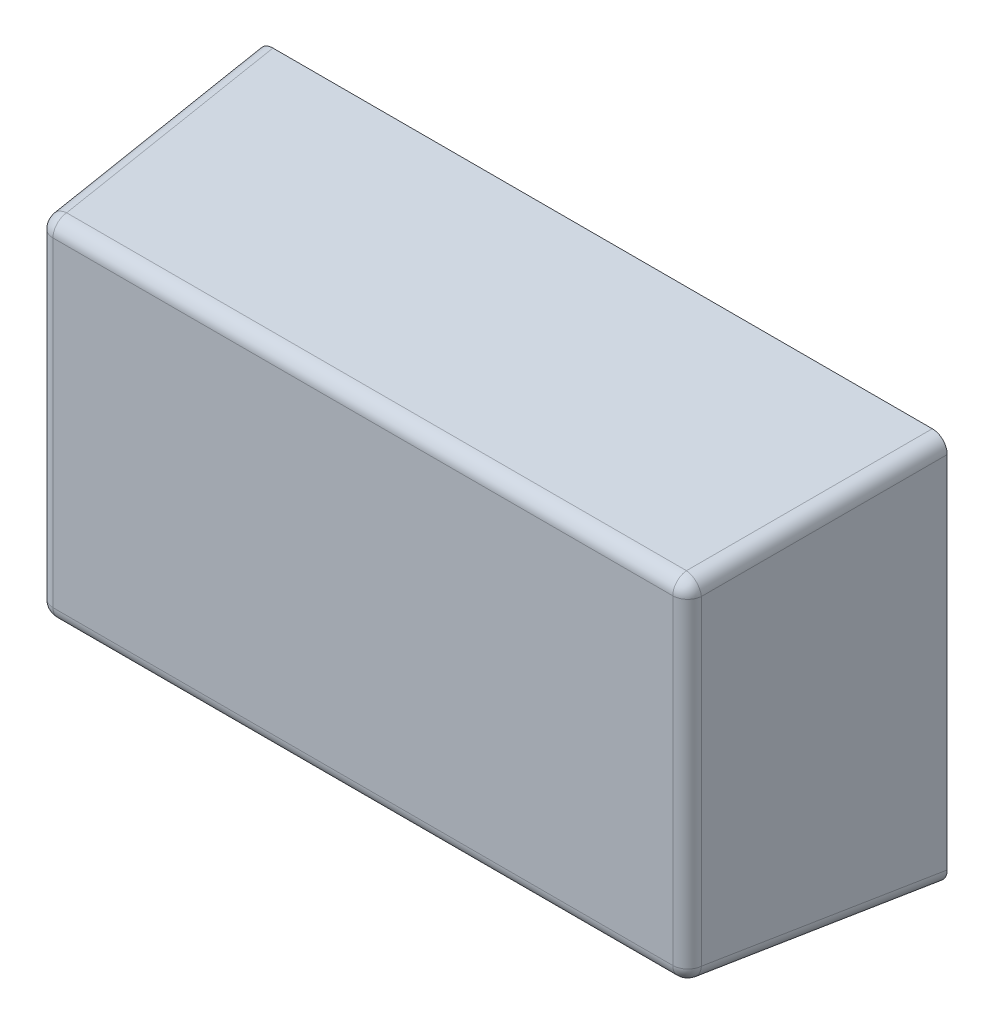
ISO-10303-21;
HEADER;
FILE_DESCRIPTION(('STEP AP214'),'2;1');
FILE_NAME('part.step','',(''),(''),'','','');
FILE_SCHEMA(('AUTOMOTIVE_DESIGN { 1 0 10303 214 1 1 1 1 }'));
ENDSEC;
DATA;
#1=APPLICATION_CONTEXT('core data for automotive mechanical design processes');
#2=APPLICATION_PROTOCOL_DEFINITION('international standard','automotive_design',2000,#1);
#3=PRODUCT_CONTEXT('',#1,'mechanical');
#4=PRODUCT('Part','Part','',(#3));
#5=PRODUCT_RELATED_PRODUCT_CATEGORY('part','',(#4));
#6=PRODUCT_DEFINITION_FORMATION('','',#4);
#7=PRODUCT_DEFINITION_CONTEXT('part definition',#1,'design');
#8=PRODUCT_DEFINITION('design','',#6,#7);
#9=PRODUCT_DEFINITION_SHAPE('','',#8);
#10=(LENGTH_UNIT() NAMED_UNIT(*) SI_UNIT(.MILLI.,.METRE.));
#11=(NAMED_UNIT(*) PLANE_ANGLE_UNIT() SI_UNIT($,.RADIAN.));
#12=(NAMED_UNIT(*) SI_UNIT($,.STERADIAN.) SOLID_ANGLE_UNIT());
#13=UNCERTAINTY_MEASURE_WITH_UNIT(LENGTH_MEASURE(1.E-05),#10,'distance_accuracy_value','');
#14=(GEOMETRIC_REPRESENTATION_CONTEXT(3) GLOBAL_UNCERTAINTY_ASSIGNED_CONTEXT((#13)) GLOBAL_UNIT_ASSIGNED_CONTEXT((#10,
#11,#12)) REPRESENTATION_CONTEXT('',''));
#15=CARTESIAN_POINT('',(0.,0.,0.));
#16=DIRECTION('',(0.,0.,1.));
#17=DIRECTION('',(1.,0.,0.));
#18=AXIS2_PLACEMENT_3D('',#15,#16,#17);
#19=CARTESIAN_POINT('',(-2.76838502095678,0.631614979043221,1.5));
#20=DIRECTION('',(0.222190287037998,0.974625599379366,0.0271370112647706));
#21=DIRECTION('',(-0.970240406133399,0.218271499831321,0.104838478944911));
#22=AXIS2_PLACEMENT_3D('',#19,#20,#21);
#23=SPHERICAL_SURFACE('',#22,0.1);
#24=CARTESIAN_POINT('',(-2.76838502095678,0.631614979043221,1.5));
#25=DIRECTION('',(0.0868265938642475,0.0868265938642476,0.992432509138967));
#26=DIRECTION('',(0.,-0.996194698091746,0.0871557427476582));
#27=AXIS2_PLACEMENT_3D('',#24,#25,#26);
#28=CIRCLE('',#27,0.1);
#29=CARTESIAN_POINT('',(-2.76838502095678,0.531995509234046,1.50871557427477));
#30=VERTEX_POINT('',#29);
#31=CARTESIAN_POINT('',(-2.86800449076595,0.631614979043221,1.50871557427477));
#32=VERTEX_POINT('',#31);
#33=EDGE_CURVE('E126',#30,#32,#28,.F.);
#34=ORIENTED_EDGE('',*,*,#33,.F.);
#35=CARTESIAN_POINT('',(-2.76838502095678,0.631614979043221,1.5));
#36=DIRECTION('',(-1.,0.,0.));
#37=DIRECTION('',(0.,-1.,0.));
#38=AXIS2_PLACEMENT_3D('',#35,#36,#37);
#39=CIRCLE('',#38,0.1);
#40=CARTESIAN_POINT('',(-2.76838502095678,0.631614979043221,1.6));
#41=VERTEX_POINT('',#40);
#42=EDGE_CURVE('E128',#41,#30,#39,.F.);
#43=ORIENTED_EDGE('',*,*,#42,.F.);
#44=CARTESIAN_POINT('',(-2.76838502095678,0.631614979043221,1.5));
#45=DIRECTION('',(0.,1.,0.));
#46=DIRECTION('',(-1.,0.,0.));
#47=AXIS2_PLACEMENT_3D('',#44,#45,#46);
#48=CIRCLE('',#47,0.1);
#49=EDGE_CURVE('E94',#32,#41,#48,.T.);
#50=ORIENTED_EDGE('',*,*,#49,.F.);
#51=EDGE_LOOP('',(#34,#43,#50));
#52=FACE_BOUND('',#51,.T.);
#53=ADVANCED_FACE('F16',(#52),#23,.T.);
#54=CARTESIAN_POINT('',(1.36838502095678,0.631614979043221,1.5));
#55=DIRECTION('',(0.222190287037998,0.974625599379366,0.0271370112647706));
#56=DIRECTION('',(-0.970240406133399,0.218271499831321,0.104838478944911));
#57=AXIS2_PLACEMENT_3D('',#54,#55,#56);
#58=SPHERICAL_SURFACE('',#57,0.1);
#59=CARTESIAN_POINT('',(1.36838502095678,0.631614979043221,1.5));
#60=DIRECTION('',(-0.0868265938642475,0.0868265938642476,0.992432509138967));
#61=DIRECTION('',(0.,-0.996194698091746,0.0871557427476582));
#62=AXIS2_PLACEMENT_3D('',#59,#60,#61);
#63=CIRCLE('',#62,0.1);
#64=CARTESIAN_POINT('',(1.46800449076595,0.631614979043219,1.50871557427477));
#65=VERTEX_POINT('',#64);
#66=CARTESIAN_POINT('',(1.36838502095678,0.531995509234047,1.50871557427477));
#67=VERTEX_POINT('',#66);
#68=EDGE_CURVE('E139',#65,#67,#63,.F.);
#69=ORIENTED_EDGE('',*,*,#68,.F.);
#70=CARTESIAN_POINT('',(1.36838502095678,0.631614979043221,1.5));
#71=DIRECTION('',(0.,-1.,0.));
#72=DIRECTION('',(0.,0.,-1.));
#73=AXIS2_PLACEMENT_3D('',#70,#71,#72);
#74=CIRCLE('',#73,0.1);
#75=CARTESIAN_POINT('',(1.36838502095678,0.631614979043221,1.6));
#76=VERTEX_POINT('',#75);
#77=EDGE_CURVE('E133',#76,#65,#74,.F.);
#78=ORIENTED_EDGE('',*,*,#77,.F.);
#79=CARTESIAN_POINT('',(1.36838502095678,0.631614979043221,1.5));
#80=DIRECTION('',(-1.,0.,0.));
#81=DIRECTION('',(0.,-1.,0.));
#82=AXIS2_PLACEMENT_3D('',#79,#80,#81);
#83=CIRCLE('',#82,0.1);
#84=EDGE_CURVE('E130',#67,#76,#83,.T.);
#85=ORIENTED_EDGE('',*,*,#84,.F.);
#86=EDGE_LOOP('',(#69,#78,#85));
#87=FACE_BOUND('',#86,.T.);
#88=ADVANCED_FACE('F154',(#87),#58,.T.);
#89=CARTESIAN_POINT('',(-2.76838502095678,2.76838502095678,1.5));
#90=DIRECTION('',(0.222190287037998,0.974625599379366,0.0271370112647706));
#91=DIRECTION('',(-0.970240406133399,0.218271499831321,0.104838478944911));
#92=AXIS2_PLACEMENT_3D('',#89,#90,#91);
#93=SPHERICAL_SURFACE('',#92,0.1);
#94=CARTESIAN_POINT('',(-2.76838502095678,2.76838502095678,1.5));
#95=DIRECTION('',(0.0868265938642475,-0.0868265938642475,0.992432509138967));
#96=DIRECTION('',(0.,-0.996194698091746,-0.0871557427476581));
#97=AXIS2_PLACEMENT_3D('',#94,#95,#96);
#98=CIRCLE('',#97,0.1);
#99=CARTESIAN_POINT('',(-2.86800449076595,2.76838502095678,1.50871557427477));
#100=VERTEX_POINT('',#99);
#101=CARTESIAN_POINT('',(-2.76838502095678,2.86800449076595,1.50871557427477));
#102=VERTEX_POINT('',#101);
#103=EDGE_CURVE('E122',#100,#102,#98,.F.);
#104=ORIENTED_EDGE('',*,*,#103,.F.);
#105=CARTESIAN_POINT('',(-2.76838502095678,2.76838502095678,1.5));
#106=DIRECTION('',(0.,1.,0.));
#107=DIRECTION('',(-1.,0.,0.));
#108=AXIS2_PLACEMENT_3D('',#105,#106,#107);
#109=CIRCLE('',#108,0.1);
#110=CARTESIAN_POINT('',(-2.76838502095678,2.76838502095678,1.6));
#111=VERTEX_POINT('',#110);
#112=EDGE_CURVE('E20',#111,#100,#109,.F.);
#113=ORIENTED_EDGE('',*,*,#112,.F.);
#114=CARTESIAN_POINT('',(-2.76838502095678,2.76838502095678,1.5));
#115=DIRECTION('',(1.,0.,0.));
#116=DIRECTION('',(0.,0.,-1.));
#117=AXIS2_PLACEMENT_3D('',#114,#115,#116);
#118=CIRCLE('',#117,0.1);
#119=EDGE_CURVE('E110',#102,#111,#118,.T.);
#120=ORIENTED_EDGE('',*,*,#119,.F.);
#121=EDGE_LOOP('',(#104,#113,#120));
#122=FACE_BOUND('',#121,.T.);
#123=ADVANCED_FACE('F120',(#122),#93,.T.);
#124=CARTESIAN_POINT('',(-0.700000000000001,1.7,1.6));
#125=DIRECTION('',(0.,0.,1.));
#126=DIRECTION('',(1.,0.,0.));
#127=AXIS2_PLACEMENT_3D('',#124,#125,#126);
#128=PLANE('',#127);
#129=DIRECTION('',(-1.,0.,0.));
#130=VECTOR('',#129,1.);
#131=CARTESIAN_POINT('',(0.449999999999999,0.631614979043221,1.6));
#132=LINE('',#131,#130);
#133=EDGE_CURVE('E132',#76,#41,#132,.T.);
#134=ORIENTED_EDGE('',*,*,#133,.F.);
#135=DIRECTION('',(0.,-1.,0.));
#136=VECTOR('',#135,1.);
#137=CARTESIAN_POINT('',(1.36838502095678,2.35,1.6));
#138=LINE('',#137,#136);
#139=CARTESIAN_POINT('',(1.36838502095678,2.76838502095678,1.6));
#140=VERTEX_POINT('',#139);
#141=EDGE_CURVE('E106',#140,#76,#138,.T.);
#142=ORIENTED_EDGE('',*,*,#141,.F.);
#143=DIRECTION('',(1.,0.,0.));
#144=VECTOR('',#143,1.);
#145=CARTESIAN_POINT('',(-1.85,2.76838502095678,1.6));
#146=LINE('',#145,#144);
#147=EDGE_CURVE('E102',#111,#140,#146,.T.);
#148=ORIENTED_EDGE('',*,*,#147,.F.);
#149=DIRECTION('',(0.,1.,0.));
#150=VECTOR('',#149,1.);
#151=CARTESIAN_POINT('',(-2.76838502095678,1.05,1.6));
#152=LINE('',#151,#150);
#153=EDGE_CURVE('E87',#41,#111,#152,.T.);
#154=ORIENTED_EDGE('',*,*,#153,.F.);
#155=EDGE_LOOP('',(#134,#142,#148,#154));
#156=FACE_BOUND('',#155,.T.);
#157=ADVANCED_FACE('F104',(#156),#128,.T.);
#158=CARTESIAN_POINT('',(1.36838502095678,2.76838502095678,1.5));
#159=DIRECTION('',(0.222190287037998,0.974625599379366,0.0271370112647706));
#160=DIRECTION('',(-0.970240406133399,0.218271499831321,0.104838478944911));
#161=AXIS2_PLACEMENT_3D('',#158,#159,#160);
#162=SPHERICAL_SURFACE('',#161,0.1);
#163=CARTESIAN_POINT('',(1.36838502095678,2.76838502095678,1.5));
#164=DIRECTION('',(-0.0868265938642475,-0.0868265938642475,0.992432509138967));
#165=DIRECTION('',(0.996194698091746,0.,0.0871557427476581));
#166=AXIS2_PLACEMENT_3D('',#163,#164,#165);
#167=CIRCLE('',#166,0.1);
#168=CARTESIAN_POINT('',(1.36838502095678,2.86800449076595,1.50871557427477));
#169=VERTEX_POINT('',#168);
#170=CARTESIAN_POINT('',(1.46800449076595,2.76838502095678,1.50871557427477));
#171=VERTEX_POINT('',#170);
#172=EDGE_CURVE('E145',#169,#171,#167,.F.);
#173=ORIENTED_EDGE('',*,*,#172,.F.);
#174=CARTESIAN_POINT('',(1.36838502095678,2.76838502095678,1.5));
#175=DIRECTION('',(1.,0.,0.));
#176=DIRECTION('',(0.,0.,-1.));
#177=AXIS2_PLACEMENT_3D('',#174,#175,#176);
#178=CIRCLE('',#177,0.1);
#179=EDGE_CURVE('E118',#140,#169,#178,.F.);
#180=ORIENTED_EDGE('',*,*,#179,.F.);
#181=CARTESIAN_POINT('',(1.36838502095678,2.76838502095678,1.5));
#182=DIRECTION('',(0.,-1.,0.));
#183=DIRECTION('',(0.,0.,-1.));
#184=AXIS2_PLACEMENT_3D('',#181,#182,#183);
#185=CIRCLE('',#184,0.1);
#186=EDGE_CURVE('E135',#171,#140,#185,.T.);
#187=ORIENTED_EDGE('',*,*,#186,.F.);
#188=EDGE_LOOP('',(#173,#180,#187));
#189=FACE_BOUND('',#188,.T.);
#190=ADVANCED_FACE('F167',(#189),#162,.T.);
#191=CARTESIAN_POINT('',(-2.76838502095678,1.05,1.5));
#192=DIRECTION('',(0.,1.,0.));
#193=DIRECTION('',(-1.,0.,0.));
#194=AXIS2_PLACEMENT_3D('',#191,#192,#193);
#195=CYLINDRICAL_SURFACE('',#194,0.1);
#196=ORIENTED_EDGE('',*,*,#49,.T.);
#197=ORIENTED_EDGE('',*,*,#153,.T.);
#198=ORIENTED_EDGE('',*,*,#112,.T.);
#199=DIRECTION('',(0.,1.,0.));
#200=VECTOR('',#199,1.);
#201=CARTESIAN_POINT('',(-2.86800449076595,0.4,1.50871557427477));
#202=LINE('',#201,#200);
#203=EDGE_CURVE('E165',#32,#100,#202,.T.);
#204=ORIENTED_EDGE('',*,*,#203,.F.);
#205=EDGE_LOOP('',(#196,#197,#198,#204));
#206=FACE_BOUND('',#205,.T.);
#207=ADVANCED_FACE('F89',(#206),#195,.T.);
#208=CARTESIAN_POINT('',(-2.88379217514343,0.516207824856568,0.180890191533714));
#209=DIRECTION('',(0.0868265938642475,0.0868265938642476,0.992432509138967));
#210=DIRECTION('',(0.,-0.996194698091746,0.0871557427476582));
#211=AXIS2_PLACEMENT_3D('',#208,#209,#210);
#212=CYLINDRICAL_SURFACE('',#211,0.1);
#213=ORIENTED_EDGE('',*,*,#33,.T.);
#214=DIRECTION('',(0.0868265938642476,0.0868265938642476,0.992432509138967));
#215=VECTOR('',#214,1.);
#216=CARTESIAN_POINT('',(-3.,0.499619469809174,0.));
#217=LINE('',#216,#215);
#218=CARTESIAN_POINT('',(-3.,0.499619469809174,0.));
#219=VERTEX_POINT('',#218);
#220=EDGE_CURVE('E254',#219,#32,#217,.T.);
#221=ORIENTED_EDGE('',*,*,#220,.F.);
#222=CARTESIAN_POINT('',(-2.89961801624567,0.500381983754335,0.));
#223=DIRECTION('',(0.,0.,1.));
#224=DIRECTION('',(0.707106781186547,0.707106781186548,0.));
#225=AXIS2_PLACEMENT_3D('',#222,#223,#224);
#226=ELLIPSE('',#225,0.100762519445035,0.1);
#227=CARTESIAN_POINT('',(-2.90038053019083,0.4,0.));
#228=VERTEX_POINT('',#227);
#229=EDGE_CURVE('E98',#219,#228,#226,.T.);
#230=ORIENTED_EDGE('',*,*,#229,.T.);
#231=DIRECTION('',(-0.0868265938642478,-0.0868265938642476,-0.992432509138967));
#232=VECTOR('',#231,1.);
#233=CARTESIAN_POINT('',(-2.76838502095678,0.531995509234046,1.50871557427477));
#234=LINE('',#233,#232);
#235=EDGE_CURVE('E246',#30,#228,#234,.T.);
#236=ORIENTED_EDGE('',*,*,#235,.F.);
#237=EDGE_LOOP('',(#213,#221,#230,#236));
#238=FACE_BOUND('',#237,.T.);
#239=ADVANCED_FACE('F173',(#238),#212,.T.);
#240=CARTESIAN_POINT('',(0.449999999999999,0.631614979043221,1.5));
#241=DIRECTION('',(-1.,0.,0.));
#242=DIRECTION('',(0.,-1.,0.));
#243=AXIS2_PLACEMENT_3D('',#240,#241,#242);
#244=CYLINDRICAL_SURFACE('',#243,0.1);
#245=ORIENTED_EDGE('',*,*,#84,.T.);
#246=ORIENTED_EDGE('',*,*,#133,.T.);
#247=ORIENTED_EDGE('',*,*,#42,.T.);
#248=DIRECTION('',(1.,0.,0.));
#249=VECTOR('',#248,1.);
#250=CARTESIAN_POINT('',(1.6,0.531995509234047,1.50871557427477));
#251=LINE('',#250,#249);
#252=EDGE_CURVE('E245',#67,#30,#251,.F.);
#253=ORIENTED_EDGE('',*,*,#252,.F.);
#254=EDGE_LOOP('',(#245,#246,#247,#253));
#255=FACE_BOUND('',#254,.T.);
#256=ADVANCED_FACE('F176',(#255),#244,.T.);
#257=CARTESIAN_POINT('',(1.36838502095678,2.35,1.5));
#258=DIRECTION('',(0.,-1.,0.));
#259=DIRECTION('',(0.,0.,-1.));
#260=AXIS2_PLACEMENT_3D('',#257,#258,#259);
#261=CYLINDRICAL_SURFACE('',#260,0.1);
#262=ORIENTED_EDGE('',*,*,#186,.T.);
#263=ORIENTED_EDGE('',*,*,#141,.T.);
#264=ORIENTED_EDGE('',*,*,#77,.T.);
#265=DIRECTION('',(0.,1.,0.));
#266=VECTOR('',#265,1.);
#267=CARTESIAN_POINT('',(1.46800449076595,3.,1.50871557427477));
#268=LINE('',#267,#266);
#269=EDGE_CURVE('E241',#171,#65,#268,.F.);
#270=ORIENTED_EDGE('',*,*,#269,.F.);
#271=EDGE_LOOP('',(#262,#263,#264,#270));
#272=FACE_BOUND('',#271,.T.);
#273=ADVANCED_FACE('F180',(#272),#261,.T.);
#274=CARTESIAN_POINT('',(1.4913310325455,0.508668967454501,0.0947206571250284));
#275=DIRECTION('',(-0.0868265938642475,0.0868265938642476,0.992432509138967));
#276=DIRECTION('',(0.,-0.996194698091746,0.0871557427476582));
#277=AXIS2_PLACEMENT_3D('',#274,#275,#276);
#278=CYLINDRICAL_SURFACE('',#277,0.1);
#279=ORIENTED_EDGE('',*,*,#68,.T.);
#280=DIRECTION('',(-0.0868265938642473,0.0868265938642476,0.992432509138967));
#281=VECTOR('',#280,1.);
#282=CARTESIAN_POINT('',(1.50038053019082,0.4,0.));
#283=LINE('',#282,#281);
#284=CARTESIAN_POINT('',(1.50038053019082,0.4,0.));
#285=VERTEX_POINT('',#284);
#286=EDGE_CURVE('E249',#285,#67,#283,.T.);
#287=ORIENTED_EDGE('',*,*,#286,.F.);
#288=CARTESIAN_POINT('',(1.49961801624566,0.500381983754335,0.));
#289=DIRECTION('',(0.,0.,1.));
#290=DIRECTION('',(-0.707106781186547,0.707106781186548,0.));
#291=AXIS2_PLACEMENT_3D('',#288,#289,#290);
#292=ELLIPSE('',#291,0.100762519445035,0.1);
#293=CARTESIAN_POINT('',(1.6,0.499619469809175,0.));
#294=VERTEX_POINT('',#293);
#295=EDGE_CURVE('E137',#285,#294,#292,.T.);
#296=ORIENTED_EDGE('',*,*,#295,.T.);
#297=DIRECTION('',(0.0868265938642474,-0.0868265938642478,-0.992432509138967));
#298=VECTOR('',#297,1.);
#299=CARTESIAN_POINT('',(1.46800449076595,0.631614979043222,1.50871557427477));
#300=LINE('',#299,#298);
#301=EDGE_CURVE('E238',#65,#294,#300,.T.);
#302=ORIENTED_EDGE('',*,*,#301,.F.);
#303=EDGE_LOOP('',(#279,#287,#296,#302));
#304=FACE_BOUND('',#303,.T.);
#305=ADVANCED_FACE('F184',(#304),#278,.T.);
#306=CARTESIAN_POINT('',(-2.8913310325455,2.8913310325455,0.0947206571250283));
#307=DIRECTION('',(0.0868265938642475,-0.0868265938642475,0.992432509138967));
#308=DIRECTION('',(0.,-0.996194698091746,-0.0871557427476581));
#309=AXIS2_PLACEMENT_3D('',#306,#307,#308);
#310=CYLINDRICAL_SURFACE('',#309,0.1);
#311=ORIENTED_EDGE('',*,*,#103,.T.);
#312=DIRECTION('',(0.0868265938642473,-0.0868265938642476,0.992432509138967));
#313=VECTOR('',#312,1.);
#314=CARTESIAN_POINT('',(-2.90038053019083,3.,0.));
#315=LINE('',#314,#313);
#316=CARTESIAN_POINT('',(-2.90038053019083,3.,0.));
#317=VERTEX_POINT('',#316);
#318=EDGE_CURVE('E225',#317,#102,#315,.T.);
#319=ORIENTED_EDGE('',*,*,#318,.F.);
#320=CARTESIAN_POINT('',(-2.89961801624567,2.89961801624567,0.));
#321=DIRECTION('',(0.,0.,1.));
#322=DIRECTION('',(0.707106781186547,-0.707106781186548,0.));
#323=AXIS2_PLACEMENT_3D('',#320,#321,#322);
#324=ELLIPSE('',#323,0.100762519445035,0.1);
#325=CARTESIAN_POINT('',(-3.,2.90038053019083,0.));
#326=VERTEX_POINT('',#325);
#327=EDGE_CURVE('E35',#317,#326,#324,.T.);
#328=ORIENTED_EDGE('',*,*,#327,.T.);
#329=DIRECTION('',(-0.0868265938642476,0.0868265938642473,-0.992432509138967));
#330=VECTOR('',#329,1.);
#331=CARTESIAN_POINT('',(-2.86800449076595,2.76838502095678,1.50871557427477));
#332=LINE('',#331,#330);
#333=EDGE_CURVE('E146',#100,#326,#332,.T.);
#334=ORIENTED_EDGE('',*,*,#333,.F.);
#335=EDGE_LOOP('',(#311,#319,#328,#334));
#336=FACE_BOUND('',#335,.T.);
#337=ADVANCED_FACE('F188',(#336),#310,.T.);
#338=CARTESIAN_POINT('',(-1.85,2.76838502095678,1.5));
#339=DIRECTION('',(1.,0.,0.));
#340=DIRECTION('',(0.,0.,-1.));
#341=AXIS2_PLACEMENT_3D('',#338,#339,#340);
#342=CYLINDRICAL_SURFACE('',#341,0.1);
#343=ORIENTED_EDGE('',*,*,#119,.T.);
#344=ORIENTED_EDGE('',*,*,#147,.T.);
#345=ORIENTED_EDGE('',*,*,#179,.T.);
#346=DIRECTION('',(1.,0.,0.));
#347=VECTOR('',#346,1.);
#348=CARTESIAN_POINT('',(-3.,2.86800449076595,1.50871557427477));
#349=LINE('',#348,#347);
#350=EDGE_CURVE('E116',#102,#169,#349,.T.);
#351=ORIENTED_EDGE('',*,*,#350,.F.);
#352=EDGE_LOOP('',(#343,#344,#345,#351));
#353=FACE_BOUND('',#352,.T.);
#354=ADVANCED_FACE('F114',(#353),#342,.T.);
#355=CARTESIAN_POINT('',(1.48379217514343,2.88379217514343,0.180890191533713));
#356=DIRECTION('',(-0.0868265938642475,-0.0868265938642475,0.992432509138967));
#357=DIRECTION('',(0.996194698091746,0.,0.0871557427476581));
#358=AXIS2_PLACEMENT_3D('',#355,#356,#357);
#359=CYLINDRICAL_SURFACE('',#358,0.1);
#360=ORIENTED_EDGE('',*,*,#172,.T.);
#361=DIRECTION('',(-0.0868265938642474,-0.0868265938642476,0.992432509138967));
#362=VECTOR('',#361,1.);
#363=CARTESIAN_POINT('',(1.6,2.90038053019083,0.));
#364=LINE('',#363,#362);
#365=CARTESIAN_POINT('',(1.6,2.90038053019083,0.));
#366=VERTEX_POINT('',#365);
#367=EDGE_CURVE('E242',#366,#171,#364,.T.);
#368=ORIENTED_EDGE('',*,*,#367,.F.);
#369=CARTESIAN_POINT('',(1.49961801624566,2.89961801624567,0.));
#370=DIRECTION('',(0.,0.,1.));
#371=DIRECTION('',(-0.707106781186548,-0.707106781186548,0.));
#372=AXIS2_PLACEMENT_3D('',#369,#370,#371);
#373=ELLIPSE('',#372,0.100762519445035,0.1);
#374=CARTESIAN_POINT('',(1.50038053019082,3.,0.));
#375=VERTEX_POINT('',#374);
#376=EDGE_CURVE('E109',#366,#375,#373,.T.);
#377=ORIENTED_EDGE('',*,*,#376,.T.);
#378=DIRECTION('',(0.0868265938642473,0.0868265938642476,-0.992432509138967));
#379=VECTOR('',#378,1.);
#380=CARTESIAN_POINT('',(1.36838502095678,2.86800449076595,1.50871557427477));
#381=LINE('',#380,#379);
#382=EDGE_CURVE('E227',#169,#375,#381,.T.);
#383=ORIENTED_EDGE('',*,*,#382,.F.);
#384=EDGE_LOOP('',(#360,#368,#377,#383));
#385=FACE_BOUND('',#384,.T.);
#386=ADVANCED_FACE('F195',(#385),#359,.T.);
#387=CARTESIAN_POINT('',(-3.,0.4,0.));
#388=DIRECTION('',(-0.996194698091746,0.,0.0871557427476581));
#389=DIRECTION('',(0.0871557427476581,0.,0.996194698091746));
#390=AXIS2_PLACEMENT_3D('',#387,#388,#389);
#391=PLANE('',#390);
#392=ORIENTED_EDGE('',*,*,#220,.T.);
#393=ORIENTED_EDGE('',*,*,#203,.T.);
#394=ORIENTED_EDGE('',*,*,#333,.T.);
#395=DIRECTION('',(0.,1.,0.));
#396=VECTOR('',#395,1.);
#397=CARTESIAN_POINT('',(-3.,1.7,0.));
#398=LINE('',#397,#396);
#399=EDGE_CURVE('E229',#326,#219,#398,.F.);
#400=ORIENTED_EDGE('',*,*,#399,.T.);
#401=EDGE_LOOP('',(#392,#393,#394,#400));
#402=FACE_BOUND('',#401,.T.);
#403=ADVANCED_FACE('F198',(#402),#391,.T.);
#404=CARTESIAN_POINT('',(1.6,0.4,0.));
#405=DIRECTION('',(0.,-0.996194698091746,0.0871557427476582));
#406=DIRECTION('',(0.,-0.0871557427476582,-0.996194698091746));
#407=AXIS2_PLACEMENT_3D('',#404,#405,#406);
#408=PLANE('',#407);
#409=ORIENTED_EDGE('',*,*,#286,.T.);
#410=ORIENTED_EDGE('',*,*,#252,.T.);
#411=ORIENTED_EDGE('',*,*,#235,.T.);
#412=DIRECTION('',(1.,0.,0.));
#413=VECTOR('',#412,1.);
#414=CARTESIAN_POINT('',(-0.700000000000001,0.4,0.));
#415=LINE('',#414,#413);
#416=EDGE_CURVE('E232',#228,#285,#415,.T.);
#417=ORIENTED_EDGE('',*,*,#416,.T.);
#418=EDGE_LOOP('',(#409,#410,#411,#417));
#419=FACE_BOUND('',#418,.T.);
#420=ADVANCED_FACE('F202',(#419),#408,.T.);
#421=CARTESIAN_POINT('',(1.6,3.,0.));
#422=DIRECTION('',(0.996194698091746,0.,0.0871557427476581));
#423=DIRECTION('',(0.0871557427476581,0.,-0.996194698091746));
#424=AXIS2_PLACEMENT_3D('',#421,#422,#423);
#425=PLANE('',#424);
#426=ORIENTED_EDGE('',*,*,#301,.T.);
#427=DIRECTION('',(0.,1.,0.));
#428=VECTOR('',#427,1.);
#429=CARTESIAN_POINT('',(1.6,1.7,0.));
#430=LINE('',#429,#428);
#431=EDGE_CURVE('E26',#294,#366,#430,.T.);
#432=ORIENTED_EDGE('',*,*,#431,.T.);
#433=ORIENTED_EDGE('',*,*,#367,.T.);
#434=ORIENTED_EDGE('',*,*,#269,.T.);
#435=EDGE_LOOP('',(#426,#432,#433,#434));
#436=FACE_BOUND('',#435,.T.);
#437=ADVANCED_FACE('F206',(#436),#425,.T.);
#438=CARTESIAN_POINT('',(-3.,3.,0.));
#439=DIRECTION('',(0.,0.996194698091746,0.0871557427476581));
#440=DIRECTION('',(0.,-0.0871557427476581,0.996194698091746));
#441=AXIS2_PLACEMENT_3D('',#438,#439,#440);
#442=PLANE('',#441);
#443=ORIENTED_EDGE('',*,*,#382,.T.);
#444=DIRECTION('',(1.,0.,0.));
#445=VECTOR('',#444,1.);
#446=CARTESIAN_POINT('',(-0.700000000000001,3.,0.));
#447=LINE('',#446,#445);
#448=EDGE_CURVE('E10',#375,#317,#447,.F.);
#449=ORIENTED_EDGE('',*,*,#448,.T.);
#450=ORIENTED_EDGE('',*,*,#318,.T.);
#451=ORIENTED_EDGE('',*,*,#350,.T.);
#452=EDGE_LOOP('',(#443,#449,#450,#451));
#453=FACE_BOUND('',#452,.T.);
#454=ADVANCED_FACE('F210',(#453),#442,.T.);
#455=CARTESIAN_POINT('',(-0.700000000000001,1.7,0.));
#456=DIRECTION('',(0.,0.,1.));
#457=DIRECTION('',(1.,0.,0.));
#458=AXIS2_PLACEMENT_3D('',#455,#456,#457);
#459=PLANE('',#458);
#460=ORIENTED_EDGE('',*,*,#448,.F.);
#461=ORIENTED_EDGE('',*,*,#376,.F.);
#462=ORIENTED_EDGE('',*,*,#431,.F.);
#463=ORIENTED_EDGE('',*,*,#295,.F.);
#464=ORIENTED_EDGE('',*,*,#416,.F.);
#465=ORIENTED_EDGE('',*,*,#229,.F.);
#466=ORIENTED_EDGE('',*,*,#399,.F.);
#467=ORIENTED_EDGE('',*,*,#327,.F.);
#468=EDGE_LOOP('',(#460,#461,#462,#463,#464,#465,#466,#467));
#469=FACE_BOUND('',#468,.T.);
#470=ADVANCED_FACE('F214',(#469),#459,.F.);
#471=CLOSED_SHELL('',(#53,#88,#123,#157,#190,#207,#239,#256,#273,#305,#337,#354,#386,#403,#420,
#437,#454,#470));
#472=MANIFOLD_SOLID_BREP('B1',#471);
#473=ADVANCED_BREP_SHAPE_REPRESENTATION('',(#18,#472),#14);
#474=SHAPE_DEFINITION_REPRESENTATION(#9,#473);
ENDSEC;
END-ISO-10303-21;
